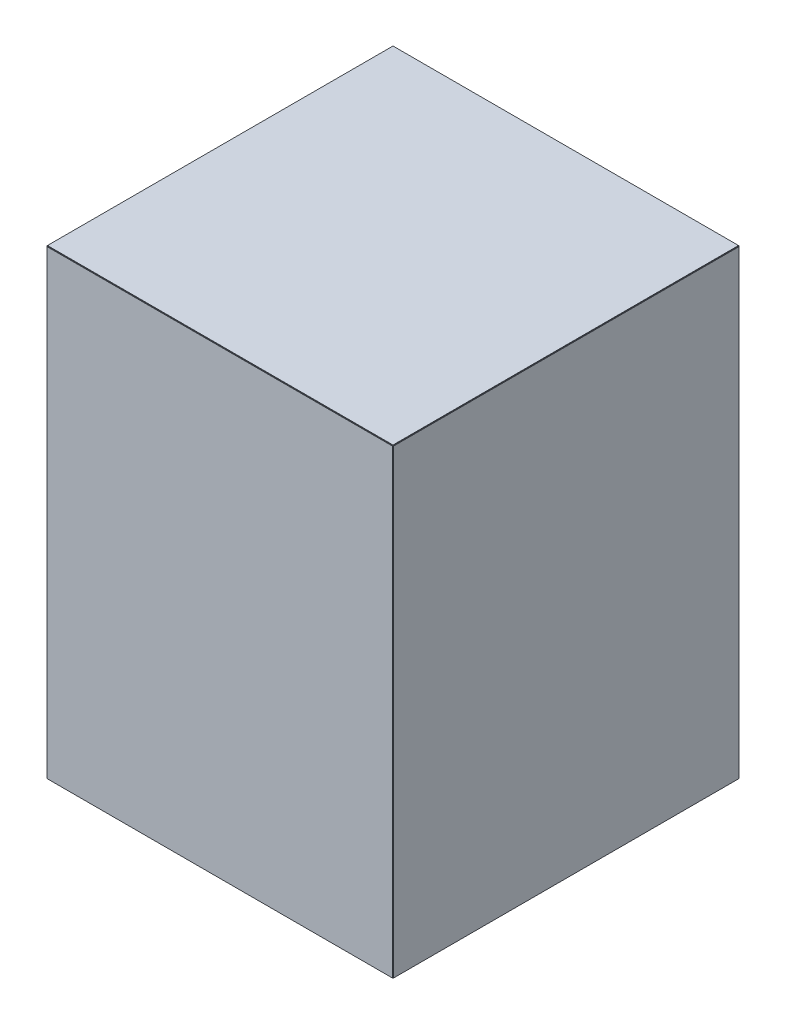
ISO-10303-21;
HEADER;
FILE_DESCRIPTION(('STEP AP214'),'2;1');
FILE_NAME('part.step','',(''),(''),'','','');
FILE_SCHEMA(('AUTOMOTIVE_DESIGN { 1 0 10303 214 1 1 1 1 }'));
ENDSEC;
DATA;
#1=APPLICATION_CONTEXT('core data for automotive mechanical design processes');
#2=APPLICATION_PROTOCOL_DEFINITION('international standard','automotive_design',2000,#1);
#3=PRODUCT_CONTEXT('',#1,'mechanical');
#4=PRODUCT('Part','Part','',(#3));
#5=PRODUCT_RELATED_PRODUCT_CATEGORY('part','',(#4));
#6=PRODUCT_DEFINITION_FORMATION('','',#4);
#7=PRODUCT_DEFINITION_CONTEXT('part definition',#1,'design');
#8=PRODUCT_DEFINITION('design','',#6,#7);
#9=PRODUCT_DEFINITION_SHAPE('','',#8);
#10=(LENGTH_UNIT() NAMED_UNIT(*) SI_UNIT(.MILLI.,.METRE.));
#11=(NAMED_UNIT(*) PLANE_ANGLE_UNIT() SI_UNIT($,.RADIAN.));
#12=(NAMED_UNIT(*) SI_UNIT($,.STERADIAN.) SOLID_ANGLE_UNIT());
#13=UNCERTAINTY_MEASURE_WITH_UNIT(LENGTH_MEASURE(1.E-05),#10,'distance_accuracy_value','');
#14=(GEOMETRIC_REPRESENTATION_CONTEXT(3) GLOBAL_UNCERTAINTY_ASSIGNED_CONTEXT((#13)) GLOBAL_UNIT_ASSIGNED_CONTEXT((#10,
#11,#12)) REPRESENTATION_CONTEXT('',''));
#15=CARTESIAN_POINT('',(0.,0.,0.));
#16=DIRECTION('',(0.,0.,1.));
#17=DIRECTION('',(1.,0.,0.));
#18=AXIS2_PLACEMENT_3D('',#15,#16,#17);
#19=CARTESIAN_POINT('',(914.4,-1219.20000000001,917.575));
#20=DIRECTION('',(-1.,0.,0.));
#21=DIRECTION('',(0.,0.,1.));
#22=AXIS2_PLACEMENT_3D('',#19,#20,#21);
#23=PLANE('',#22);
#24=DIRECTION('',(0.,1.,0.));
#25=VECTOR('',#24,1.);
#26=CARTESIAN_POINT('',(914.4,-1219.20000000001,914.4));
#27=LINE('',#26,#25);
#28=CARTESIAN_POINT('',(914.4,-1219.20000000001,914.4));
#29=VERTEX_POINT('',#28);
#30=CARTESIAN_POINT('',(914.4,1219.2,914.4));
#31=VERTEX_POINT('',#30);
#32=EDGE_CURVE('E112',#29,#31,#27,.T.);
#33=ORIENTED_EDGE('',*,*,#32,.T.);
#34=DIRECTION('',(0.,0.,-1.));
#35=VECTOR('',#34,1.);
#36=CARTESIAN_POINT('',(914.4,1219.2,917.575));
#37=LINE('',#36,#35);
#38=CARTESIAN_POINT('',(914.4,1219.2,917.575));
#39=VERTEX_POINT('',#38);
#40=EDGE_CURVE('E12',#39,#31,#37,.T.);
#41=ORIENTED_EDGE('',*,*,#40,.F.);
#42=DIRECTION('',(0.,1.,0.));
#43=VECTOR('',#42,1.);
#44=CARTESIAN_POINT('',(914.4,-1219.20000000001,917.575));
#45=LINE('',#44,#43);
#46=CARTESIAN_POINT('',(914.4,-1219.20000000001,917.575));
#47=VERTEX_POINT('',#46);
#48=EDGE_CURVE('E100',#47,#39,#45,.T.);
#49=ORIENTED_EDGE('',*,*,#48,.F.);
#50=DIRECTION('',(0.,0.,-1.));
#51=VECTOR('',#50,1.);
#52=CARTESIAN_POINT('',(914.4,-1219.20000000001,917.575));
#53=LINE('',#52,#51);
#54=EDGE_CURVE('E108',#47,#29,#53,.T.);
#55=ORIENTED_EDGE('',*,*,#54,.T.);
#56=EDGE_LOOP('',(#33,#41,#49,#55));
#57=FACE_BOUND('',#56,.T.);
#58=ADVANCED_FACE('F49',(#57),#23,.F.);
#59=CARTESIAN_POINT('',(-914.400000000002,1219.2,917.575));
#60=DIRECTION('',(0.,-1.,0.));
#61=DIRECTION('',(0.,0.,-1.));
#62=AXIS2_PLACEMENT_3D('',#59,#60,#61);
#63=PLANE('',#62);
#64=DIRECTION('',(-1.,0.,0.));
#65=VECTOR('',#64,1.);
#66=CARTESIAN_POINT('',(-914.400000000002,1219.2,914.4));
#67=LINE('',#66,#65);
#68=CARTESIAN_POINT('',(-914.400000000002,1219.2,914.4));
#69=VERTEX_POINT('',#68);
#70=EDGE_CURVE('E104',#31,#69,#67,.T.);
#71=ORIENTED_EDGE('',*,*,#70,.T.);
#72=DIRECTION('',(0.,0.,-1.));
#73=VECTOR('',#72,1.);
#74=CARTESIAN_POINT('',(-914.400000000002,1219.2,917.575));
#75=LINE('',#74,#73);
#76=CARTESIAN_POINT('',(-914.400000000002,1219.2,917.575));
#77=VERTEX_POINT('',#76);
#78=EDGE_CURVE('E57',#77,#69,#75,.T.);
#79=ORIENTED_EDGE('',*,*,#78,.F.);
#80=DIRECTION('',(-1.,0.,0.));
#81=VECTOR('',#80,1.);
#82=CARTESIAN_POINT('',(-914.400000000002,1219.2,917.575));
#83=LINE('',#82,#81);
#84=EDGE_CURVE('E95',#39,#77,#83,.T.);
#85=ORIENTED_EDGE('',*,*,#84,.F.);
#86=ORIENTED_EDGE('',*,*,#40,.T.);
#87=EDGE_LOOP('',(#71,#79,#85,#86));
#88=FACE_BOUND('',#87,.T.);
#89=ADVANCED_FACE('F103',(#88),#63,.F.);
#90=CARTESIAN_POINT('',(-914.400000000002,-1219.20000000001,917.575));
#91=DIRECTION('',(1.,0.,0.));
#92=DIRECTION('',(0.,0.,-1.));
#93=AXIS2_PLACEMENT_3D('',#90,#91,#92);
#94=PLANE('',#93);
#95=DIRECTION('',(0.,-1.,0.));
#96=VECTOR('',#95,1.);
#97=CARTESIAN_POINT('',(-914.400000000002,-1219.20000000001,914.4));
#98=LINE('',#97,#96);
#99=CARTESIAN_POINT('',(-914.400000000002,-1219.20000000001,914.4));
#100=VERTEX_POINT('',#99);
#101=EDGE_CURVE('E82',#69,#100,#98,.T.);
#102=ORIENTED_EDGE('',*,*,#101,.T.);
#103=DIRECTION('',(0.,0.,-1.));
#104=VECTOR('',#103,1.);
#105=CARTESIAN_POINT('',(-914.400000000002,-1219.20000000001,917.575));
#106=LINE('',#105,#104);
#107=CARTESIAN_POINT('',(-914.400000000002,-1219.20000000001,917.575));
#108=VERTEX_POINT('',#107);
#109=EDGE_CURVE('E105',#108,#100,#106,.T.);
#110=ORIENTED_EDGE('',*,*,#109,.F.);
#111=DIRECTION('',(0.,-1.,0.));
#112=VECTOR('',#111,1.);
#113=CARTESIAN_POINT('',(-914.400000000002,-1219.20000000001,917.575));
#114=LINE('',#113,#112);
#115=EDGE_CURVE('E98',#77,#108,#114,.T.);
#116=ORIENTED_EDGE('',*,*,#115,.F.);
#117=ORIENTED_EDGE('',*,*,#78,.T.);
#118=EDGE_LOOP('',(#102,#110,#116,#117));
#119=FACE_BOUND('',#118,.T.);
#120=ADVANCED_FACE('F106',(#119),#94,.F.);
#121=CARTESIAN_POINT('',(-914.400000000002,-1219.20000000001,917.575));
#122=DIRECTION('',(0.,1.,0.));
#123=DIRECTION('',(0.,0.,1.));
#124=AXIS2_PLACEMENT_3D('',#121,#122,#123);
#125=PLANE('',#124);
#126=DIRECTION('',(1.,0.,0.));
#127=VECTOR('',#126,1.);
#128=CARTESIAN_POINT('',(-914.400000000002,-1219.20000000001,914.4));
#129=LINE('',#128,#127);
#130=EDGE_CURVE('E88',#100,#29,#129,.T.);
#131=ORIENTED_EDGE('',*,*,#130,.T.);
#132=ORIENTED_EDGE('',*,*,#54,.F.);
#133=DIRECTION('',(1.,0.,0.));
#134=VECTOR('',#133,1.);
#135=CARTESIAN_POINT('',(-914.400000000002,-1219.20000000001,917.575));
#136=LINE('',#135,#134);
#137=EDGE_CURVE('E65',#108,#47,#136,.T.);
#138=ORIENTED_EDGE('',*,*,#137,.F.);
#139=ORIENTED_EDGE('',*,*,#109,.T.);
#140=EDGE_LOOP('',(#131,#132,#138,#139));
#141=FACE_BOUND('',#140,.T.);
#142=ADVANCED_FACE('F119',(#141),#125,.F.);
#143=CARTESIAN_POINT('',(0.,0.,917.575));
#144=DIRECTION('',(0.,0.,-1.));
#145=DIRECTION('',(-1.,0.,0.));
#146=AXIS2_PLACEMENT_3D('',#143,#144,#145);
#147=PLANE('',#146);
#148=ORIENTED_EDGE('',*,*,#48,.T.);
#149=ORIENTED_EDGE('',*,*,#84,.T.);
#150=ORIENTED_EDGE('',*,*,#115,.T.);
#151=ORIENTED_EDGE('',*,*,#137,.T.);
#152=EDGE_LOOP('',(#148,#149,#150,#151));
#153=FACE_BOUND('',#152,.T.);
#154=ADVANCED_FACE('F96',(#153),#147,.F.);
#155=CARTESIAN_POINT('',(0.,0.,914.4));
#156=DIRECTION('',(0.,0.,-1.));
#157=DIRECTION('',(-1.,0.,0.));
#158=AXIS2_PLACEMENT_3D('',#155,#156,#157);
#159=PLANE('',#158);
#160=ORIENTED_EDGE('',*,*,#32,.F.);
#161=ORIENTED_EDGE('',*,*,#130,.F.);
#162=ORIENTED_EDGE('',*,*,#101,.F.);
#163=ORIENTED_EDGE('',*,*,#70,.F.);
#164=EDGE_LOOP('',(#160,#161,#162,#163));
#165=FACE_BOUND('',#164,.T.);
#166=ADVANCED_FACE('F122',(#165),#159,.T.);
#167=CLOSED_SHELL('',(#58,#89,#120,#142,#154,#166));
#168=MANIFOLD_SOLID_BREP('B2_NOT_SHOWN',#167);
#169=CARTESIAN_POINT('',(917.574999999999,-1219.19999999997,-914.399999999997));
#170=DIRECTION('',(0.,0.,1.));
#171=DIRECTION('',(1.,0.,0.));
#172=AXIS2_PLACEMENT_3D('',#169,#170,#171);
#173=PLANE('',#172);
#174=DIRECTION('',(0.,1.,0.));
#175=VECTOR('',#174,1.);
#176=CARTESIAN_POINT('',(914.399999999999,-1219.19999999997,-914.399999999997));
#177=LINE('',#176,#175);
#178=CARTESIAN_POINT('',(914.399999999999,-1219.19999999997,-914.399999999997));
#179=VERTEX_POINT('',#178);
#180=CARTESIAN_POINT('',(914.399999999999,1219.2,-914.399999999997));
#181=VERTEX_POINT('',#180);
#182=EDGE_CURVE('E245',#179,#181,#177,.T.);
#183=ORIENTED_EDGE('',*,*,#182,.T.);
#184=DIRECTION('',(-1.,0.,0.));
#185=VECTOR('',#184,1.);
#186=CARTESIAN_POINT('',(917.574999999999,1219.2,-914.399999999997));
#187=LINE('',#186,#185);
#188=CARTESIAN_POINT('',(917.574999999999,1219.2,-914.399999999997));
#189=VERTEX_POINT('',#188);
#190=EDGE_CURVE('E47',#189,#181,#187,.T.);
#191=ORIENTED_EDGE('',*,*,#190,.F.);
#192=DIRECTION('',(0.,1.,0.));
#193=VECTOR('',#192,1.);
#194=CARTESIAN_POINT('',(917.574999999999,-1219.19999999997,-914.399999999997));
#195=LINE('',#194,#193);
#196=CARTESIAN_POINT('',(917.574999999999,-1219.19999999997,-914.399999999997));
#197=VERTEX_POINT('',#196);
#198=EDGE_CURVE('E233',#197,#189,#195,.T.);
#199=ORIENTED_EDGE('',*,*,#198,.F.);
#200=DIRECTION('',(-1.,0.,0.));
#201=VECTOR('',#200,1.);
#202=CARTESIAN_POINT('',(917.574999999999,-1219.19999999997,-914.399999999997));
#203=LINE('',#202,#201);
#204=EDGE_CURVE('E241',#197,#179,#203,.T.);
#205=ORIENTED_EDGE('',*,*,#204,.T.);
#206=EDGE_LOOP('',(#183,#191,#199,#205));
#207=FACE_BOUND('',#206,.T.);
#208=ADVANCED_FACE('F182',(#207),#173,.F.);
#209=CARTESIAN_POINT('',(917.574999999999,1219.2,914.399999999965));
#210=DIRECTION('',(0.,-1.,0.));
#211=DIRECTION('',(1.,0.,0.));
#212=AXIS2_PLACEMENT_3D('',#209,#210,#211);
#213=PLANE('',#212);
#214=DIRECTION('',(0.,0.,1.));
#215=VECTOR('',#214,1.);
#216=CARTESIAN_POINT('',(914.399999999999,1219.2,914.399999999965));
#217=LINE('',#216,#215);
#218=CARTESIAN_POINT('',(914.399999999999,1219.2,914.399999999965));
#219=VERTEX_POINT('',#218);
#220=EDGE_CURVE('E237',#181,#219,#217,.T.);
#221=ORIENTED_EDGE('',*,*,#220,.T.);
#222=DIRECTION('',(-1.,0.,0.));
#223=VECTOR('',#222,1.);
#224=CARTESIAN_POINT('',(917.574999999999,1219.2,914.399999999965));
#225=LINE('',#224,#223);
#226=CARTESIAN_POINT('',(917.574999999999,1219.2,914.399999999965));
#227=VERTEX_POINT('',#226);
#228=EDGE_CURVE('E190',#227,#219,#225,.T.);
#229=ORIENTED_EDGE('',*,*,#228,.F.);
#230=DIRECTION('',(0.,0.,1.));
#231=VECTOR('',#230,1.);
#232=CARTESIAN_POINT('',(917.574999999999,1219.2,914.399999999965));
#233=LINE('',#232,#231);
#234=EDGE_CURVE('E228',#189,#227,#233,.T.);
#235=ORIENTED_EDGE('',*,*,#234,.F.);
#236=ORIENTED_EDGE('',*,*,#190,.T.);
#237=EDGE_LOOP('',(#221,#229,#235,#236));
#238=FACE_BOUND('',#237,.T.);
#239=ADVANCED_FACE('F236',(#238),#213,.F.);
#240=CARTESIAN_POINT('',(917.574999999999,-1219.19999999997,914.399999999965));
#241=DIRECTION('',(0.,0.,-1.));
#242=DIRECTION('',(-1.,0.,0.));
#243=AXIS2_PLACEMENT_3D('',#240,#241,#242);
#244=PLANE('',#243);
#245=DIRECTION('',(0.,-1.,0.));
#246=VECTOR('',#245,1.);
#247=CARTESIAN_POINT('',(914.399999999999,-1219.19999999997,914.399999999965));
#248=LINE('',#247,#246);
#249=CARTESIAN_POINT('',(914.399999999999,-1219.19999999997,914.399999999965));
#250=VERTEX_POINT('',#249);
#251=EDGE_CURVE('E215',#219,#250,#248,.T.);
#252=ORIENTED_EDGE('',*,*,#251,.T.);
#253=DIRECTION('',(-1.,0.,0.));
#254=VECTOR('',#253,1.);
#255=CARTESIAN_POINT('',(917.574999999999,-1219.19999999997,914.399999999965));
#256=LINE('',#255,#254);
#257=CARTESIAN_POINT('',(917.574999999999,-1219.19999999997,914.399999999965));
#258=VERTEX_POINT('',#257);
#259=EDGE_CURVE('E238',#258,#250,#256,.T.);
#260=ORIENTED_EDGE('',*,*,#259,.F.);
#261=DIRECTION('',(0.,-1.,0.));
#262=VECTOR('',#261,1.);
#263=CARTESIAN_POINT('',(917.574999999999,-1219.19999999997,914.399999999965));
#264=LINE('',#263,#262);
#265=EDGE_CURVE('E231',#227,#258,#264,.T.);
#266=ORIENTED_EDGE('',*,*,#265,.F.);
#267=ORIENTED_EDGE('',*,*,#228,.T.);
#268=EDGE_LOOP('',(#252,#260,#266,#267));
#269=FACE_BOUND('',#268,.T.);
#270=ADVANCED_FACE('F239',(#269),#244,.F.);
#271=CARTESIAN_POINT('',(917.574999999999,-1219.19999999997,914.399999999965));
#272=DIRECTION('',(0.,1.,0.));
#273=DIRECTION('',(-1.,0.,0.));
#274=AXIS2_PLACEMENT_3D('',#271,#272,#273);
#275=PLANE('',#274);
#276=DIRECTION('',(0.,0.,-1.));
#277=VECTOR('',#276,1.);
#278=CARTESIAN_POINT('',(914.399999999999,-1219.19999999997,914.399999999965));
#279=LINE('',#278,#277);
#280=EDGE_CURVE('E221',#250,#179,#279,.T.);
#281=ORIENTED_EDGE('',*,*,#280,.T.);
#282=ORIENTED_EDGE('',*,*,#204,.F.);
#283=DIRECTION('',(0.,0.,-1.));
#284=VECTOR('',#283,1.);
#285=CARTESIAN_POINT('',(917.574999999999,-1219.19999999997,914.399999999965));
#286=LINE('',#285,#284);
#287=EDGE_CURVE('E198',#258,#197,#286,.T.);
#288=ORIENTED_EDGE('',*,*,#287,.F.);
#289=ORIENTED_EDGE('',*,*,#259,.T.);
#290=EDGE_LOOP('',(#281,#282,#288,#289));
#291=FACE_BOUND('',#290,.T.);
#292=ADVANCED_FACE('F252',(#291),#275,.F.);
#293=CARTESIAN_POINT('',(917.574999999999,0.,0.));
#294=DIRECTION('',(-1.,0.,0.));
#295=DIRECTION('',(0.,0.,1.));
#296=AXIS2_PLACEMENT_3D('',#293,#294,#295);
#297=PLANE('',#296);
#298=ORIENTED_EDGE('',*,*,#198,.T.);
#299=ORIENTED_EDGE('',*,*,#234,.T.);
#300=ORIENTED_EDGE('',*,*,#265,.T.);
#301=ORIENTED_EDGE('',*,*,#287,.T.);
#302=EDGE_LOOP('',(#298,#299,#300,#301));
#303=FACE_BOUND('',#302,.T.);
#304=ADVANCED_FACE('F229',(#303),#297,.F.);
#305=CARTESIAN_POINT('',(914.399999999999,0.,0.));
#306=DIRECTION('',(-1.,0.,0.));
#307=DIRECTION('',(0.,0.,1.));
#308=AXIS2_PLACEMENT_3D('',#305,#306,#307);
#309=PLANE('',#308);
#310=ORIENTED_EDGE('',*,*,#182,.F.);
#311=ORIENTED_EDGE('',*,*,#280,.F.);
#312=ORIENTED_EDGE('',*,*,#251,.F.);
#313=ORIENTED_EDGE('',*,*,#220,.F.);
#314=EDGE_LOOP('',(#310,#311,#312,#313));
#315=FACE_BOUND('',#314,.T.);
#316=ADVANCED_FACE('F255',(#315),#309,.T.);
#317=CLOSED_SHELL('',(#208,#239,#270,#292,#304,#316));
#318=MANIFOLD_SOLID_BREP('B6',#317);
#319=CARTESIAN_POINT('',(-917.574999999998,-1219.19999999996,914.4));
#320=DIRECTION('',(0.,0.,-1.));
#321=DIRECTION('',(-1.,0.,0.));
#322=AXIS2_PLACEMENT_3D('',#319,#320,#321);
#323=PLANE('',#322);
#324=DIRECTION('',(0.,1.,0.));
#325=VECTOR('',#324,1.);
#326=CARTESIAN_POINT('',(-914.399999999998,-1219.19999999996,914.4));
#327=LINE('',#326,#325);
#328=CARTESIAN_POINT('',(-914.399999999998,-1219.19999999996,914.4));
#329=VERTEX_POINT('',#328);
#330=CARTESIAN_POINT('',(-914.400000000002,1219.2,914.4));
#331=VERTEX_POINT('',#330);
#332=EDGE_CURVE('E378',#329,#331,#327,.T.);
#333=ORIENTED_EDGE('',*,*,#332,.T.);
#334=DIRECTION('',(1.,0.,0.));
#335=VECTOR('',#334,1.);
#336=CARTESIAN_POINT('',(-917.575000000002,1219.2,914.4));
#337=LINE('',#336,#335);
#338=CARTESIAN_POINT('',(-917.575000000002,1219.2,914.4));
#339=VERTEX_POINT('',#338);
#340=EDGE_CURVE('E180',#339,#331,#337,.T.);
#341=ORIENTED_EDGE('',*,*,#340,.F.);
#342=DIRECTION('',(0.,1.,0.));
#343=VECTOR('',#342,1.);
#344=CARTESIAN_POINT('',(-917.574999999998,-1219.19999999996,914.4));
#345=LINE('',#344,#343);
#346=CARTESIAN_POINT('',(-917.574999999998,-1219.19999999996,914.4));
#347=VERTEX_POINT('',#346);
#348=EDGE_CURVE('E366',#347,#339,#345,.T.);
#349=ORIENTED_EDGE('',*,*,#348,.F.);
#350=DIRECTION('',(1.,0.,0.));
#351=VECTOR('',#350,1.);
#352=CARTESIAN_POINT('',(-917.574999999998,-1219.19999999996,914.4));
#353=LINE('',#352,#351);
#354=EDGE_CURVE('E374',#347,#329,#353,.T.);
#355=ORIENTED_EDGE('',*,*,#354,.T.);
#356=EDGE_LOOP('',(#333,#341,#349,#355));
#357=FACE_BOUND('',#356,.T.);
#358=ADVANCED_FACE('F315',(#357),#323,.F.);
#359=CARTESIAN_POINT('',(-917.575000000002,1219.2,-914.400000000046));
#360=DIRECTION('',(0.,-1.,0.));
#361=DIRECTION('',(1.,0.,0.));
#362=AXIS2_PLACEMENT_3D('',#359,#360,#361);
#363=PLANE('',#362);
#364=DIRECTION('',(0.,0.,-1.));
#365=VECTOR('',#364,1.);
#366=CARTESIAN_POINT('',(-914.400000000002,1219.2,-914.400000000046));
#367=LINE('',#366,#365);
#368=CARTESIAN_POINT('',(-914.400000000002,1219.2,-914.400000000046));
#369=VERTEX_POINT('',#368);
#370=EDGE_CURVE('E370',#331,#369,#367,.T.);
#371=ORIENTED_EDGE('',*,*,#370,.T.);
#372=DIRECTION('',(1.,0.,0.));
#373=VECTOR('',#372,1.);
#374=CARTESIAN_POINT('',(-917.575000000002,1219.2,-914.400000000046));
#375=LINE('',#374,#373);
#376=CARTESIAN_POINT('',(-917.575000000002,1219.2,-914.400000000046));
#377=VERTEX_POINT('',#376);
#378=EDGE_CURVE('E323',#377,#369,#375,.T.);
#379=ORIENTED_EDGE('',*,*,#378,.F.);
#380=DIRECTION('',(0.,0.,-1.));
#381=VECTOR('',#380,1.);
#382=CARTESIAN_POINT('',(-917.575000000002,1219.2,-914.400000000046));
#383=LINE('',#382,#381);
#384=EDGE_CURVE('E361',#339,#377,#383,.T.);
#385=ORIENTED_EDGE('',*,*,#384,.F.);
#386=ORIENTED_EDGE('',*,*,#340,.T.);
#387=EDGE_LOOP('',(#371,#379,#385,#386));
#388=FACE_BOUND('',#387,.T.);
#389=ADVANCED_FACE('F369',(#388),#363,.F.);
#390=CARTESIAN_POINT('',(-917.574999999998,-1219.19999999996,-914.400000000046));
#391=DIRECTION('',(0.,0.,1.));
#392=DIRECTION('',(1.,0.,0.));
#393=AXIS2_PLACEMENT_3D('',#390,#391,#392);
#394=PLANE('',#393);
#395=DIRECTION('',(0.,-1.,0.));
#396=VECTOR('',#395,1.);
#397=CARTESIAN_POINT('',(-914.399999999998,-1219.19999999996,-914.400000000046));
#398=LINE('',#397,#396);
#399=CARTESIAN_POINT('',(-914.399999999998,-1219.19999999996,-914.400000000046));
#400=VERTEX_POINT('',#399);
#401=EDGE_CURVE('E348',#369,#400,#398,.T.);
#402=ORIENTED_EDGE('',*,*,#401,.T.);
#403=DIRECTION('',(1.,0.,0.));
#404=VECTOR('',#403,1.);
#405=CARTESIAN_POINT('',(-917.574999999998,-1219.19999999996,-914.400000000046));
#406=LINE('',#405,#404);
#407=CARTESIAN_POINT('',(-917.574999999998,-1219.19999999996,-914.400000000046));
#408=VERTEX_POINT('',#407);
#409=EDGE_CURVE('E371',#408,#400,#406,.T.);
#410=ORIENTED_EDGE('',*,*,#409,.F.);
#411=DIRECTION('',(0.,-1.,0.));
#412=VECTOR('',#411,1.);
#413=CARTESIAN_POINT('',(-917.574999999998,-1219.19999999996,-914.400000000046));
#414=LINE('',#413,#412);
#415=EDGE_CURVE('E364',#377,#408,#414,.T.);
#416=ORIENTED_EDGE('',*,*,#415,.F.);
#417=ORIENTED_EDGE('',*,*,#378,.T.);
#418=EDGE_LOOP('',(#402,#410,#416,#417));
#419=FACE_BOUND('',#418,.T.);
#420=ADVANCED_FACE('F372',(#419),#394,.F.);
#421=CARTESIAN_POINT('',(-917.574999999998,-1219.19999999996,-914.400000000046));
#422=DIRECTION('',(0.,1.,0.));
#423=DIRECTION('',(-1.,0.,0.));
#424=AXIS2_PLACEMENT_3D('',#421,#422,#423);
#425=PLANE('',#424);
#426=DIRECTION('',(0.,0.,1.));
#427=VECTOR('',#426,1.);
#428=CARTESIAN_POINT('',(-914.399999999998,-1219.19999999996,-914.400000000046));
#429=LINE('',#428,#427);
#430=EDGE_CURVE('E354',#400,#329,#429,.T.);
#431=ORIENTED_EDGE('',*,*,#430,.T.);
#432=ORIENTED_EDGE('',*,*,#354,.F.);
#433=DIRECTION('',(0.,0.,1.));
#434=VECTOR('',#433,1.);
#435=CARTESIAN_POINT('',(-917.574999999998,-1219.19999999996,-914.400000000046));
#436=LINE('',#435,#434);
#437=EDGE_CURVE('E331',#408,#347,#436,.T.);
#438=ORIENTED_EDGE('',*,*,#437,.F.);
#439=ORIENTED_EDGE('',*,*,#409,.T.);
#440=EDGE_LOOP('',(#431,#432,#438,#439));
#441=FACE_BOUND('',#440,.T.);
#442=ADVANCED_FACE('F385',(#441),#425,.F.);
#443=CARTESIAN_POINT('',(-917.575,-1.4204494062457E-12,0.));
#444=DIRECTION('',(1.,0.,0.));
#445=DIRECTION('',(0.,1.,0.));
#446=AXIS2_PLACEMENT_3D('',#443,#444,#445);
#447=PLANE('',#446);
#448=ORIENTED_EDGE('',*,*,#348,.T.);
#449=ORIENTED_EDGE('',*,*,#384,.T.);
#450=ORIENTED_EDGE('',*,*,#415,.T.);
#451=ORIENTED_EDGE('',*,*,#437,.T.);
#452=EDGE_LOOP('',(#448,#449,#450,#451));
#453=FACE_BOUND('',#452,.T.);
#454=ADVANCED_FACE('F362',(#453),#447,.F.);
#455=CARTESIAN_POINT('',(-914.4,-1.4155343563971E-12,0.));
#456=DIRECTION('',(1.,0.,0.));
#457=DIRECTION('',(0.,1.,0.));
#458=AXIS2_PLACEMENT_3D('',#455,#456,#457);
#459=PLANE('',#458);
#460=ORIENTED_EDGE('',*,*,#332,.F.);
#461=ORIENTED_EDGE('',*,*,#430,.F.);
#462=ORIENTED_EDGE('',*,*,#401,.F.);
#463=ORIENTED_EDGE('',*,*,#370,.F.);
#464=EDGE_LOOP('',(#460,#461,#462,#463));
#465=FACE_BOUND('',#464,.T.);
#466=ADVANCED_FACE('F388',(#465),#459,.T.);
#467=CLOSED_SHELL('',(#358,#389,#420,#442,#454,#466));
#468=MANIFOLD_SOLID_BREP('B41',#467);
#469=CARTESIAN_POINT('',(-914.4,-1219.19999999998,-917.574999999998));
#470=DIRECTION('',(1.,0.,0.));
#471=DIRECTION('',(0.,0.,-1.));
#472=AXIS2_PLACEMENT_3D('',#469,#470,#471);
#473=PLANE('',#472);
#474=DIRECTION('',(0.,1.,0.));
#475=VECTOR('',#474,1.);
#476=CARTESIAN_POINT('',(-914.4,-1219.19999999998,-914.399999999998));
#477=LINE('',#476,#475);
#478=CARTESIAN_POINT('',(-914.4,-1219.19999999998,-914.399999999998));
#479=VERTEX_POINT('',#478);
#480=CARTESIAN_POINT('',(-914.4,1219.2,-914.399999999997));
#481=VERTEX_POINT('',#480);
#482=EDGE_CURVE('E510',#479,#481,#477,.T.);
#483=ORIENTED_EDGE('',*,*,#482,.T.);
#484=DIRECTION('',(0.,0.,1.));
#485=VECTOR('',#484,1.);
#486=CARTESIAN_POINT('',(-914.4,1219.2,-917.574999999997));
#487=LINE('',#486,#485);
#488=CARTESIAN_POINT('',(-914.4,1219.2,-917.574999999997));
#489=VERTEX_POINT('',#488);
#490=EDGE_CURVE('E313',#489,#481,#487,.T.);
#491=ORIENTED_EDGE('',*,*,#490,.F.);
#492=DIRECTION('',(0.,1.,0.));
#493=VECTOR('',#492,1.);
#494=CARTESIAN_POINT('',(-914.4,-1219.19999999998,-917.574999999998));
#495=LINE('',#494,#493);
#496=CARTESIAN_POINT('',(-914.4,-1219.19999999998,-917.574999999998));
#497=VERTEX_POINT('',#496);
#498=EDGE_CURVE('E498',#497,#489,#495,.T.);
#499=ORIENTED_EDGE('',*,*,#498,.F.);
#500=DIRECTION('',(0.,0.,1.));
#501=VECTOR('',#500,1.);
#502=CARTESIAN_POINT('',(-914.4,-1219.19999999998,-917.574999999998));
#503=LINE('',#502,#501);
#504=EDGE_CURVE('E506',#497,#479,#503,.T.);
#505=ORIENTED_EDGE('',*,*,#504,.T.);
#506=EDGE_LOOP('',(#483,#491,#499,#505));
#507=FACE_BOUND('',#506,.T.);
#508=ADVANCED_FACE('F447',(#507),#473,.F.);
#509=CARTESIAN_POINT('',(914.399999999996,1219.2,-917.574999999997));
#510=DIRECTION('',(0.,-1.,0.));
#511=DIRECTION('',(0.,0.,-1.));
#512=AXIS2_PLACEMENT_3D('',#509,#510,#511);
#513=PLANE('',#512);
#514=DIRECTION('',(1.,0.,0.));
#515=VECTOR('',#514,1.);
#516=CARTESIAN_POINT('',(914.399999999996,1219.2,-914.399999999997));
#517=LINE('',#516,#515);
#518=CARTESIAN_POINT('',(914.399999999996,1219.2,-914.399999999997));
#519=VERTEX_POINT('',#518);
#520=EDGE_CURVE('E502',#481,#519,#517,.T.);
#521=ORIENTED_EDGE('',*,*,#520,.T.);
#522=DIRECTION('',(0.,0.,1.));
#523=VECTOR('',#522,1.);
#524=CARTESIAN_POINT('',(914.399999999996,1219.2,-917.574999999997));
#525=LINE('',#524,#523);
#526=CARTESIAN_POINT('',(914.399999999996,1219.2,-917.574999999997));
#527=VERTEX_POINT('',#526);
#528=EDGE_CURVE('E455',#527,#519,#525,.T.);
#529=ORIENTED_EDGE('',*,*,#528,.F.);
#530=DIRECTION('',(1.,0.,0.));
#531=VECTOR('',#530,1.);
#532=CARTESIAN_POINT('',(914.399999999996,1219.2,-917.574999999997));
#533=LINE('',#532,#531);
#534=EDGE_CURVE('E493',#489,#527,#533,.T.);
#535=ORIENTED_EDGE('',*,*,#534,.F.);
#536=ORIENTED_EDGE('',*,*,#490,.T.);
#537=EDGE_LOOP('',(#521,#529,#535,#536));
#538=FACE_BOUND('',#537,.T.);
#539=ADVANCED_FACE('F501',(#538),#513,.F.);
#540=CARTESIAN_POINT('',(914.399999999996,-1219.19999999998,-917.574999999999));
#541=DIRECTION('',(-1.,0.,0.));
#542=DIRECTION('',(0.,0.,1.));
#543=AXIS2_PLACEMENT_3D('',#540,#541,#542);
#544=PLANE('',#543);
#545=DIRECTION('',(0.,-1.,0.));
#546=VECTOR('',#545,1.);
#547=CARTESIAN_POINT('',(914.399999999996,-1219.19999999998,-914.399999999998));
#548=LINE('',#547,#546);
#549=CARTESIAN_POINT('',(914.399999999996,-1219.19999999998,-914.399999999998));
#550=VERTEX_POINT('',#549);
#551=EDGE_CURVE('E480',#519,#550,#548,.T.);
#552=ORIENTED_EDGE('',*,*,#551,.T.);
#553=DIRECTION('',(0.,0.,1.));
#554=VECTOR('',#553,1.);
#555=CARTESIAN_POINT('',(914.399999999996,-1219.19999999998,-917.574999999999));
#556=LINE('',#555,#554);
#557=CARTESIAN_POINT('',(914.399999999996,-1219.19999999998,-917.574999999999));
#558=VERTEX_POINT('',#557);
#559=EDGE_CURVE('E503',#558,#550,#556,.T.);
#560=ORIENTED_EDGE('',*,*,#559,.F.);
#561=DIRECTION('',(0.,-1.,0.));
#562=VECTOR('',#561,1.);
#563=CARTESIAN_POINT('',(914.399999999996,-1219.19999999998,-917.574999999999));
#564=LINE('',#563,#562);
#565=EDGE_CURVE('E496',#527,#558,#564,.T.);
#566=ORIENTED_EDGE('',*,*,#565,.F.);
#567=ORIENTED_EDGE('',*,*,#528,.T.);
#568=EDGE_LOOP('',(#552,#560,#566,#567));
#569=FACE_BOUND('',#568,.T.);
#570=ADVANCED_FACE('F504',(#569),#544,.F.);
#571=CARTESIAN_POINT('',(914.399999999996,-1219.19999999998,-917.574999999999));
#572=DIRECTION('',(0.,1.,0.));
#573=DIRECTION('',(0.,0.,1.));
#574=AXIS2_PLACEMENT_3D('',#571,#572,#573);
#575=PLANE('',#574);
#576=DIRECTION('',(-1.,0.,0.));
#577=VECTOR('',#576,1.);
#578=CARTESIAN_POINT('',(914.399999999996,-1219.19999999998,-914.399999999998));
#579=LINE('',#578,#577);
#580=EDGE_CURVE('E486',#550,#479,#579,.T.);
#581=ORIENTED_EDGE('',*,*,#580,.T.);
#582=ORIENTED_EDGE('',*,*,#504,.F.);
#583=DIRECTION('',(-1.,0.,0.));
#584=VECTOR('',#583,1.);
#585=CARTESIAN_POINT('',(914.399999999996,-1219.19999999998,-917.574999999999));
#586=LINE('',#585,#584);
#587=EDGE_CURVE('E463',#558,#497,#586,.T.);
#588=ORIENTED_EDGE('',*,*,#587,.F.);
#589=ORIENTED_EDGE('',*,*,#559,.T.);
#590=EDGE_LOOP('',(#581,#582,#588,#589));
#591=FACE_BOUND('',#590,.T.);
#592=ADVANCED_FACE('F517',(#591),#575,.F.);
#593=CARTESIAN_POINT('',(-1.11407796568288E-13,4.17779237131084E-13,-917.574999999998));
#594=DIRECTION('',(0.,0.,1.));
#595=DIRECTION('',(0.,-1.,0.));
#596=AXIS2_PLACEMENT_3D('',#593,#594,#595);
#597=PLANE('',#596);
#598=ORIENTED_EDGE('',*,*,#498,.T.);
#599=ORIENTED_EDGE('',*,*,#534,.T.);
#600=ORIENTED_EDGE('',*,*,#565,.T.);
#601=ORIENTED_EDGE('',*,*,#587,.T.);
#602=EDGE_LOOP('',(#598,#599,#600,#601));
#603=FACE_BOUND('',#602,.T.);
#604=ADVANCED_FACE('F494',(#603),#597,.F.);
#605=CARTESIAN_POINT('',(-1.11022302462516E-13,4.16333634234437E-13,-914.399999999998));
#606=DIRECTION('',(0.,0.,1.));
#607=DIRECTION('',(0.,-1.,0.));
#608=AXIS2_PLACEMENT_3D('',#605,#606,#607);
#609=PLANE('',#608);
#610=ORIENTED_EDGE('',*,*,#482,.F.);
#611=ORIENTED_EDGE('',*,*,#580,.F.);
#612=ORIENTED_EDGE('',*,*,#551,.F.);
#613=ORIENTED_EDGE('',*,*,#520,.F.);
#614=EDGE_LOOP('',(#610,#611,#612,#613));
#615=FACE_BOUND('',#614,.T.);
#616=ADVANCED_FACE('F520',(#615),#609,.T.);
#617=CLOSED_SHELL('',(#508,#539,#570,#592,#604,#616));
#618=MANIFOLD_SOLID_BREP('B174',#617);
#619=CARTESIAN_POINT('',(-914.4,1222.375,-914.400000000032));
#620=DIRECTION('',(1.,0.,0.));
#621=DIRECTION('',(0.,1.,0.));
#622=AXIS2_PLACEMENT_3D('',#619,#620,#621);
#623=PLANE('',#622);
#624=DIRECTION('',(0.,0.,1.));
#625=VECTOR('',#624,1.);
#626=CARTESIAN_POINT('',(-914.4,1219.2,-914.400000000032));
#627=LINE('',#626,#625);
#628=CARTESIAN_POINT('',(-914.4,1219.2,-914.400000000032));
#629=VERTEX_POINT('',#628);
#630=CARTESIAN_POINT('',(-914.4,1219.2,914.4));
#631=VERTEX_POINT('',#630);
#632=EDGE_CURVE('E635',#629,#631,#627,.T.);
#633=ORIENTED_EDGE('',*,*,#632,.T.);
#634=DIRECTION('',(0.,-1.,0.));
#635=VECTOR('',#634,1.);
#636=CARTESIAN_POINT('',(-914.4,1222.375,914.4));
#637=LINE('',#636,#635);
#638=CARTESIAN_POINT('',(-914.4,1222.375,914.4));
#639=VERTEX_POINT('',#638);
#640=EDGE_CURVE('E445',#639,#631,#637,.T.);
#641=ORIENTED_EDGE('',*,*,#640,.F.);
#642=DIRECTION('',(0.,0.,1.));
#643=VECTOR('',#642,1.);
#644=CARTESIAN_POINT('',(-914.4,1222.375,-914.400000000032));
#645=LINE('',#644,#643);
#646=CARTESIAN_POINT('',(-914.4,1222.375,-914.400000000032));
#647=VERTEX_POINT('',#646);
#648=EDGE_CURVE('E623',#647,#639,#645,.T.);
#649=ORIENTED_EDGE('',*,*,#648,.F.);
#650=DIRECTION('',(0.,-1.,0.));
#651=VECTOR('',#650,1.);
#652=CARTESIAN_POINT('',(-914.4,1222.375,-914.400000000032));
#653=LINE('',#652,#651);
#654=EDGE_CURVE('E631',#647,#629,#653,.T.);
#655=ORIENTED_EDGE('',*,*,#654,.T.);
#656=EDGE_LOOP('',(#633,#641,#649,#655));
#657=FACE_BOUND('',#656,.T.);
#658=ADVANCED_FACE('F572',(#657),#623,.F.);
#659=CARTESIAN_POINT('',(914.4,1222.375,914.4));
#660=DIRECTION('',(0.,0.,-1.));
#661=DIRECTION('',(0.,1.,0.));
#662=AXIS2_PLACEMENT_3D('',#659,#660,#661);
#663=PLANE('',#662);
#664=DIRECTION('',(1.,0.,0.));
#665=VECTOR('',#664,1.);
#666=CARTESIAN_POINT('',(914.4,1219.2,914.4));
#667=LINE('',#666,#665);
#668=CARTESIAN_POINT('',(914.4,1219.2,914.4));
#669=VERTEX_POINT('',#668);
#670=EDGE_CURVE('E627',#631,#669,#667,.T.);
#671=ORIENTED_EDGE('',*,*,#670,.T.);
#672=DIRECTION('',(0.,-1.,0.));
#673=VECTOR('',#672,1.);
#674=CARTESIAN_POINT('',(914.4,1222.375,914.4));
#675=LINE('',#674,#673);
#676=CARTESIAN_POINT('',(914.4,1222.375,914.4));
#677=VERTEX_POINT('',#676);
#678=EDGE_CURVE('E580',#677,#669,#675,.T.);
#679=ORIENTED_EDGE('',*,*,#678,.F.);
#680=DIRECTION('',(1.,0.,0.));
#681=VECTOR('',#680,1.);
#682=CARTESIAN_POINT('',(914.4,1222.375,914.4));
#683=LINE('',#682,#681);
#684=EDGE_CURVE('E618',#639,#677,#683,.T.);
#685=ORIENTED_EDGE('',*,*,#684,.F.);
#686=ORIENTED_EDGE('',*,*,#640,.T.);
#687=EDGE_LOOP('',(#671,#679,#685,#686));
#688=FACE_BOUND('',#687,.T.);
#689=ADVANCED_FACE('F626',(#688),#663,.F.);
#690=CARTESIAN_POINT('',(914.4,1222.375,-914.400000000032));
#691=DIRECTION('',(-1.,0.,0.));
#692=DIRECTION('',(0.,-1.,0.));
#693=AXIS2_PLACEMENT_3D('',#690,#691,#692);
#694=PLANE('',#693);
#695=DIRECTION('',(0.,0.,-1.));
#696=VECTOR('',#695,1.);
#697=CARTESIAN_POINT('',(914.4,1219.2,-914.400000000032));
#698=LINE('',#697,#696);
#699=CARTESIAN_POINT('',(914.4,1219.2,-914.400000000032));
#700=VERTEX_POINT('',#699);
#701=EDGE_CURVE('E605',#669,#700,#698,.T.);
#702=ORIENTED_EDGE('',*,*,#701,.T.);
#703=DIRECTION('',(0.,-1.,0.));
#704=VECTOR('',#703,1.);
#705=CARTESIAN_POINT('',(914.4,1222.375,-914.400000000032));
#706=LINE('',#705,#704);
#707=CARTESIAN_POINT('',(914.4,1222.375,-914.400000000032));
#708=VERTEX_POINT('',#707);
#709=EDGE_CURVE('E628',#708,#700,#706,.T.);
#710=ORIENTED_EDGE('',*,*,#709,.F.);
#711=DIRECTION('',(0.,0.,-1.));
#712=VECTOR('',#711,1.);
#713=CARTESIAN_POINT('',(914.4,1222.375,-914.400000000032));
#714=LINE('',#713,#712);
#715=EDGE_CURVE('E621',#677,#708,#714,.T.);
#716=ORIENTED_EDGE('',*,*,#715,.F.);
#717=ORIENTED_EDGE('',*,*,#678,.T.);
#718=EDGE_LOOP('',(#702,#710,#716,#717));
#719=FACE_BOUND('',#718,.T.);
#720=ADVANCED_FACE('F629',(#719),#694,.F.);
#721=CARTESIAN_POINT('',(914.4,1222.375,-914.400000000032));
#722=DIRECTION('',(0.,0.,1.));
#723=DIRECTION('',(0.,-1.,0.));
#724=AXIS2_PLACEMENT_3D('',#721,#722,#723);
#725=PLANE('',#724);
#726=DIRECTION('',(-1.,0.,0.));
#727=VECTOR('',#726,1.);
#728=CARTESIAN_POINT('',(914.4,1219.2,-914.400000000032));
#729=LINE('',#728,#727);
#730=EDGE_CURVE('E611',#700,#629,#729,.T.);
#731=ORIENTED_EDGE('',*,*,#730,.T.);
#732=ORIENTED_EDGE('',*,*,#654,.F.);
#733=DIRECTION('',(-1.,0.,0.));
#734=VECTOR('',#733,1.);
#735=CARTESIAN_POINT('',(914.4,1222.375,-914.400000000032));
#736=LINE('',#735,#734);
#737=EDGE_CURVE('E588',#708,#647,#736,.T.);
#738=ORIENTED_EDGE('',*,*,#737,.F.);
#739=ORIENTED_EDGE('',*,*,#709,.T.);
#740=EDGE_LOOP('',(#731,#732,#738,#739));
#741=FACE_BOUND('',#740,.T.);
#742=ADVANCED_FACE('F642',(#741),#725,.F.);
#743=CARTESIAN_POINT('',(-1.4841523072246E-13,1222.375,0.));
#744=DIRECTION('',(0.,-1.,0.));
#745=DIRECTION('',(1.,0.,0.));
#746=AXIS2_PLACEMENT_3D('',#743,#744,#745);
#747=PLANE('',#746);
#748=ORIENTED_EDGE('',*,*,#648,.T.);
#749=ORIENTED_EDGE('',*,*,#684,.T.);
#750=ORIENTED_EDGE('',*,*,#715,.T.);
#751=ORIENTED_EDGE('',*,*,#737,.T.);
#752=EDGE_LOOP('',(#748,#749,#750,#751));
#753=FACE_BOUND('',#752,.T.);
#754=ADVANCED_FACE('F619',(#753),#747,.F.);
#755=CARTESIAN_POINT('',(-1.48029736616688E-13,1219.2,0.));
#756=DIRECTION('',(0.,-1.,0.));
#757=DIRECTION('',(1.,0.,0.));
#758=AXIS2_PLACEMENT_3D('',#755,#756,#757);
#759=PLANE('',#758);
#760=ORIENTED_EDGE('',*,*,#632,.F.);
#761=ORIENTED_EDGE('',*,*,#730,.F.);
#762=ORIENTED_EDGE('',*,*,#701,.F.);
#763=ORIENTED_EDGE('',*,*,#670,.F.);
#764=EDGE_LOOP('',(#760,#761,#762,#763));
#765=FACE_BOUND('',#764,.T.);
#766=ADVANCED_FACE('F645',(#765),#759,.T.);
#767=CLOSED_SHELL('',(#658,#689,#720,#742,#754,#766));
#768=MANIFOLD_SOLID_BREP('B307',#767);
#769=ADVANCED_BREP_SHAPE_REPRESENTATION('',(#18,#168,#318,#468,#618,#768),#14);
#770=SHAPE_DEFINITION_REPRESENTATION(#9,#769);
ENDSEC;
END-ISO-10303-21;
